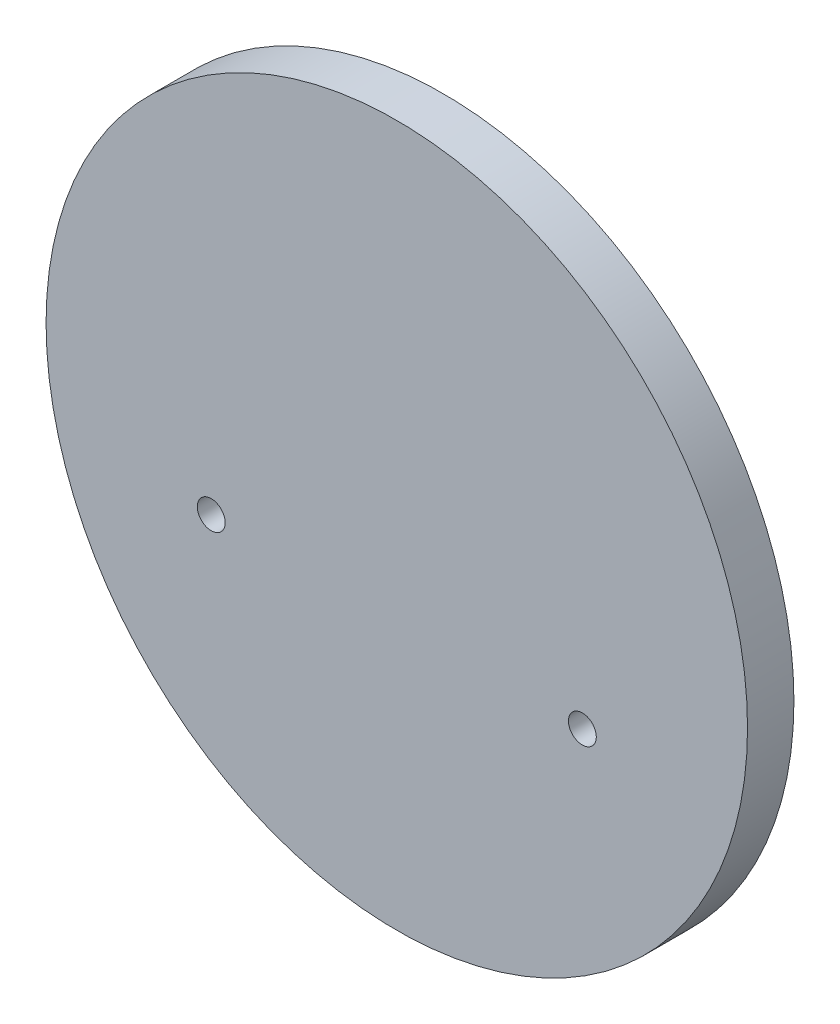
ISO-10303-21;
HEADER;
FILE_DESCRIPTION(('STEP AP214'),'2;1');
FILE_NAME('part.step','',(''),(''),'','','');
FILE_SCHEMA(('AUTOMOTIVE_DESIGN { 1 0 10303 214 1 1 1 1 }'));
ENDSEC;
DATA;
#1=APPLICATION_CONTEXT('core data for automotive mechanical design processes');
#2=APPLICATION_PROTOCOL_DEFINITION('international standard','automotive_design',2000,#1);
#3=PRODUCT_CONTEXT('',#1,'mechanical');
#4=PRODUCT('Part','Part','',(#3));
#5=PRODUCT_RELATED_PRODUCT_CATEGORY('part','',(#4));
#6=PRODUCT_DEFINITION_FORMATION('','',#4);
#7=PRODUCT_DEFINITION_CONTEXT('part definition',#1,'design');
#8=PRODUCT_DEFINITION('design','',#6,#7);
#9=PRODUCT_DEFINITION_SHAPE('','',#8);
#10=(LENGTH_UNIT() NAMED_UNIT(*) SI_UNIT(.MILLI.,.METRE.));
#11=(NAMED_UNIT(*) PLANE_ANGLE_UNIT() SI_UNIT($,.RADIAN.));
#12=(NAMED_UNIT(*) SI_UNIT($,.STERADIAN.) SOLID_ANGLE_UNIT());
#13=UNCERTAINTY_MEASURE_WITH_UNIT(LENGTH_MEASURE(1.E-05),#10,'distance_accuracy_value','');
#14=(GEOMETRIC_REPRESENTATION_CONTEXT(3) GLOBAL_UNCERTAINTY_ASSIGNED_CONTEXT((#13)) GLOBAL_UNIT_ASSIGNED_CONTEXT((#10,
#11,#12)) REPRESENTATION_CONTEXT('',''));
#15=CARTESIAN_POINT('',(0.,0.,0.));
#16=DIRECTION('',(0.,0.,1.));
#17=DIRECTION('',(1.,0.,0.));
#18=AXIS2_PLACEMENT_3D('',#15,#16,#17);
#19=CARTESIAN_POINT('',(0.,0.,5.));
#20=DIRECTION('',(0.,0.,1.));
#21=DIRECTION('',(1.,0.,0.));
#22=AXIS2_PLACEMENT_3D('',#19,#20,#21);
#23=PLANE('',#22);
#24=CARTESIAN_POINT('',(-20.,-9.,5.));
#25=DIRECTION('',(0.,0.,1.));
#26=DIRECTION('',(1.,0.,0.));
#27=AXIS2_PLACEMENT_3D('',#24,#25,#26);
#28=CIRCLE('',#27,1.5);
#29=CARTESIAN_POINT('',(-18.5,-9.,5.));
#30=VERTEX_POINT('',#29);
#31=EDGE_CURVE('E62',#30,#30,#28,.T.);
#32=ORIENTED_EDGE('',*,*,#31,.F.);
#33=EDGE_LOOP('',(#32));
#34=FACE_BOUND('',#33,.T.);
#35=CARTESIAN_POINT('',(0.,0.,5.));
#36=DIRECTION('',(0.,0.,1.));
#37=DIRECTION('',(1.,0.,0.));
#38=AXIS2_PLACEMENT_3D('',#35,#36,#37);
#39=CIRCLE('',#38,37.8);
#40=CARTESIAN_POINT('',(37.8,0.,5.));
#41=VERTEX_POINT('',#40);
#42=EDGE_CURVE('E12',#41,#41,#39,.T.);
#43=ORIENTED_EDGE('',*,*,#42,.T.);
#44=EDGE_LOOP('',(#43));
#45=FACE_BOUND('',#44,.T.);
#46=CARTESIAN_POINT('',(20.,-9.00000000000001,5.));
#47=DIRECTION('',(0.,0.,1.));
#48=DIRECTION('',(1.,0.,0.));
#49=AXIS2_PLACEMENT_3D('',#46,#47,#48);
#50=CIRCLE('',#49,1.5);
#51=CARTESIAN_POINT('',(21.5,-9.00000000000001,5.));
#52=VERTEX_POINT('',#51);
#53=EDGE_CURVE('E68',#52,#52,#50,.T.);
#54=ORIENTED_EDGE('',*,*,#53,.F.);
#55=EDGE_LOOP('',(#54));
#56=FACE_BOUND('',#55,.T.);
#57=ADVANCED_FACE('F48',(#34,#45,#56),#23,.T.);
#58=CARTESIAN_POINT('',(0.,0.,0.));
#59=DIRECTION('',(0.,0.,1.));
#60=DIRECTION('',(1.,0.,0.));
#61=AXIS2_PLACEMENT_3D('',#58,#59,#60);
#62=PLANE('',#61);
#63=CARTESIAN_POINT('',(0.,0.,0.));
#64=DIRECTION('',(0.,0.,1.));
#65=DIRECTION('',(1.,0.,0.));
#66=AXIS2_PLACEMENT_3D('',#63,#64,#65);
#67=CIRCLE('',#66,37.8);
#68=CARTESIAN_POINT('',(37.8,0.,0.));
#69=VERTEX_POINT('',#68);
#70=EDGE_CURVE('E52',#69,#69,#67,.T.);
#71=ORIENTED_EDGE('',*,*,#70,.F.);
#72=EDGE_LOOP('',(#71));
#73=FACE_BOUND('',#72,.T.);
#74=CARTESIAN_POINT('',(-20.,-9.,0.));
#75=DIRECTION('',(0.,0.,1.));
#76=DIRECTION('',(1.,0.,0.));
#77=AXIS2_PLACEMENT_3D('',#74,#75,#76);
#78=CIRCLE('',#77,1.5);
#79=CARTESIAN_POINT('',(-18.5,-9.,0.));
#80=VERTEX_POINT('',#79);
#81=EDGE_CURVE('E64',#80,#80,#78,.T.);
#82=ORIENTED_EDGE('',*,*,#81,.T.);
#83=EDGE_LOOP('',(#82));
#84=FACE_BOUND('',#83,.T.);
#85=CARTESIAN_POINT('',(20.,-9.00000000000001,0.));
#86=DIRECTION('',(0.,0.,1.));
#87=DIRECTION('',(1.,0.,0.));
#88=AXIS2_PLACEMENT_3D('',#85,#86,#87);
#89=CIRCLE('',#88,1.5);
#90=CARTESIAN_POINT('',(21.5,-9.00000000000001,0.));
#91=VERTEX_POINT('',#90);
#92=EDGE_CURVE('E72',#91,#91,#89,.T.);
#93=ORIENTED_EDGE('',*,*,#92,.T.);
#94=EDGE_LOOP('',(#93));
#95=FACE_BOUND('',#94,.T.);
#96=ADVANCED_FACE('F85',(#73,#84,#95),#62,.F.);
#97=CARTESIAN_POINT('',(0.,0.,5.));
#98=DIRECTION('',(0.,0.,-1.));
#99=DIRECTION('',(-1.,0.,0.));
#100=AXIS2_PLACEMENT_3D('',#97,#98,#99);
#101=CYLINDRICAL_SURFACE('',#100,37.8);
#102=ORIENTED_EDGE('',*,*,#42,.F.);
#103=EDGE_LOOP('',(#102));
#104=FACE_BOUND('',#103,.T.);
#105=ORIENTED_EDGE('',*,*,#70,.T.);
#106=EDGE_LOOP('',(#105));
#107=FACE_BOUND('',#106,.T.);
#108=ADVANCED_FACE('F50',(#104,#107),#101,.T.);
#109=CARTESIAN_POINT('',(-20.,-9.,5.));
#110=DIRECTION('',(0.,0.,-1.));
#111=DIRECTION('',(-1.,0.,0.));
#112=AXIS2_PLACEMENT_3D('',#109,#110,#111);
#113=CYLINDRICAL_SURFACE('',#112,1.5);
#114=ORIENTED_EDGE('',*,*,#31,.T.);
#115=EDGE_LOOP('',(#114));
#116=FACE_BOUND('',#115,.T.);
#117=ORIENTED_EDGE('',*,*,#81,.F.);
#118=EDGE_LOOP('',(#117));
#119=FACE_BOUND('',#118,.T.);
#120=ADVANCED_FACE('F94',(#116,#119),#113,.F.);
#121=CARTESIAN_POINT('',(20.,-9.00000000000001,5.));
#122=DIRECTION('',(0.,0.,-1.));
#123=DIRECTION('',(-1.,0.,0.));
#124=AXIS2_PLACEMENT_3D('',#121,#122,#123);
#125=CYLINDRICAL_SURFACE('',#124,1.5);
#126=ORIENTED_EDGE('',*,*,#53,.T.);
#127=EDGE_LOOP('',(#126));
#128=FACE_BOUND('',#127,.T.);
#129=ORIENTED_EDGE('',*,*,#92,.F.);
#130=EDGE_LOOP('',(#129));
#131=FACE_BOUND('',#130,.T.);
#132=ADVANCED_FACE('F81',(#128,#131),#125,.F.);
#133=CLOSED_SHELL('',(#57,#96,#108,#120,#132));
#134=MANIFOLD_SOLID_BREP('B2',#133);
#135=ADVANCED_BREP_SHAPE_REPRESENTATION('',(#18,#134),#14);
#136=SHAPE_DEFINITION_REPRESENTATION(#9,#135);
ENDSEC;
END-ISO-10303-21;
